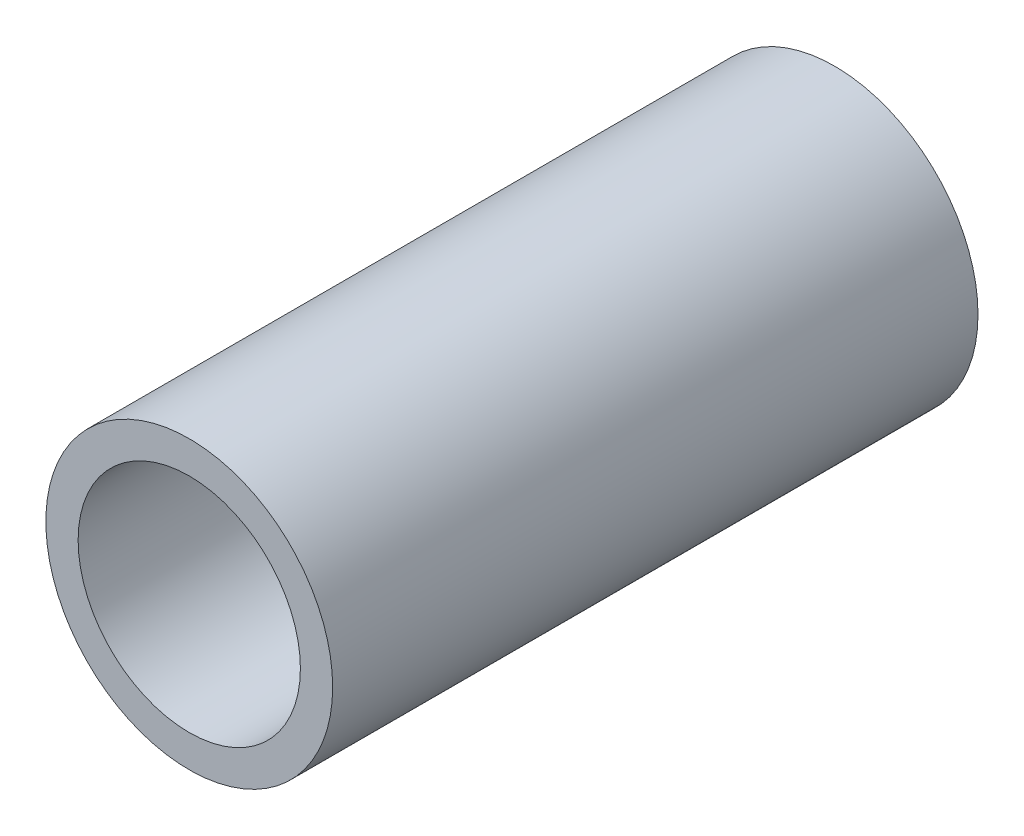
ISO-10303-21;
HEADER;
FILE_DESCRIPTION(('STEP AP214'),'2;1');
FILE_NAME('part.step','',(''),(''),'','','');
FILE_SCHEMA(('AUTOMOTIVE_DESIGN { 1 0 10303 214 1 1 1 1 }'));
ENDSEC;
DATA;
#1=APPLICATION_CONTEXT('core data for automotive mechanical design processes');
#2=APPLICATION_PROTOCOL_DEFINITION('international standard','automotive_design',2000,#1);
#3=PRODUCT_CONTEXT('',#1,'mechanical');
#4=PRODUCT('Part','Part','',(#3));
#5=PRODUCT_RELATED_PRODUCT_CATEGORY('part','',(#4));
#6=PRODUCT_DEFINITION_FORMATION('','',#4);
#7=PRODUCT_DEFINITION_CONTEXT('part definition',#1,'design');
#8=PRODUCT_DEFINITION('design','',#6,#7);
#9=PRODUCT_DEFINITION_SHAPE('','',#8);
#10=(LENGTH_UNIT() NAMED_UNIT(*) SI_UNIT(.MILLI.,.METRE.));
#11=(NAMED_UNIT(*) PLANE_ANGLE_UNIT() SI_UNIT($,.RADIAN.));
#12=(NAMED_UNIT(*) SI_UNIT($,.STERADIAN.) SOLID_ANGLE_UNIT());
#13=UNCERTAINTY_MEASURE_WITH_UNIT(LENGTH_MEASURE(1.E-05),#10,'distance_accuracy_value','');
#14=(GEOMETRIC_REPRESENTATION_CONTEXT(3) GLOBAL_UNCERTAINTY_ASSIGNED_CONTEXT((#13)) GLOBAL_UNIT_ASSIGNED_CONTEXT((#10,
#11,#12)) REPRESENTATION_CONTEXT('',''));
#15=CARTESIAN_POINT('',(0.,0.,0.));
#16=DIRECTION('',(0.,0.,1.));
#17=DIRECTION('',(1.,0.,0.));
#18=AXIS2_PLACEMENT_3D('',#15,#16,#17);
#19=CARTESIAN_POINT('',(0.,0.,4.5));
#20=DIRECTION('',(0.,0.,1.));
#21=DIRECTION('',(1.,0.,0.));
#22=AXIS2_PLACEMENT_3D('',#19,#20,#21);
#23=PLANE('',#22);
#24=CARTESIAN_POINT('',(0.,0.,4.5));
#25=DIRECTION('',(0.,0.,1.));
#26=DIRECTION('',(1.,0.,0.));
#27=AXIS2_PLACEMENT_3D('',#24,#25,#26);
#28=CIRCLE('',#27,1.);
#29=CARTESIAN_POINT('',(1.,0.,4.5));
#30=VERTEX_POINT('',#29);
#31=EDGE_CURVE('E10',#30,#30,#28,.T.);
#32=ORIENTED_EDGE('',*,*,#31,.T.);
#33=EDGE_LOOP('',(#32));
#34=FACE_BOUND('',#33,.T.);
#35=CARTESIAN_POINT('',(0.,0.,4.5));
#36=DIRECTION('',(0.,0.,1.));
#37=DIRECTION('',(1.,0.,0.));
#38=AXIS2_PLACEMENT_3D('',#35,#36,#37);
#39=CIRCLE('',#38,0.775);
#40=CARTESIAN_POINT('',(0.775,0.,4.5));
#41=VERTEX_POINT('',#40);
#42=EDGE_CURVE('E46',#41,#41,#39,.T.);
#43=ORIENTED_EDGE('',*,*,#42,.F.);
#44=EDGE_LOOP('',(#43));
#45=FACE_BOUND('',#44,.T.);
#46=ADVANCED_FACE('F35',(#34,#45),#23,.T.);
#47=CARTESIAN_POINT('',(0.,0.,0.));
#48=DIRECTION('',(0.,0.,1.));
#49=DIRECTION('',(1.,0.,0.));
#50=AXIS2_PLACEMENT_3D('',#47,#48,#49);
#51=PLANE('',#50);
#52=CARTESIAN_POINT('',(0.,0.,0.));
#53=DIRECTION('',(0.,0.,1.));
#54=DIRECTION('',(1.,0.,0.));
#55=AXIS2_PLACEMENT_3D('',#52,#53,#54);
#56=CIRCLE('',#55,1.);
#57=CARTESIAN_POINT('',(1.,0.,0.));
#58=VERTEX_POINT('',#57);
#59=EDGE_CURVE('E39',#58,#58,#56,.T.);
#60=ORIENTED_EDGE('',*,*,#59,.F.);
#61=EDGE_LOOP('',(#60));
#62=FACE_BOUND('',#61,.T.);
#63=CARTESIAN_POINT('',(0.,0.,0.));
#64=DIRECTION('',(0.,0.,1.));
#65=DIRECTION('',(1.,0.,0.));
#66=AXIS2_PLACEMENT_3D('',#63,#64,#65);
#67=CIRCLE('',#66,0.775);
#68=CARTESIAN_POINT('',(0.775,0.,0.));
#69=VERTEX_POINT('',#68);
#70=EDGE_CURVE('E48',#69,#69,#67,.T.);
#71=ORIENTED_EDGE('',*,*,#70,.T.);
#72=EDGE_LOOP('',(#71));
#73=FACE_BOUND('',#72,.T.);
#74=ADVANCED_FACE('F58',(#62,#73),#51,.F.);
#75=CARTESIAN_POINT('',(0.,0.,4.5));
#76=DIRECTION('',(0.,0.,-1.));
#77=DIRECTION('',(-1.,0.,0.));
#78=AXIS2_PLACEMENT_3D('',#75,#76,#77);
#79=CYLINDRICAL_SURFACE('',#78,1.);
#80=ORIENTED_EDGE('',*,*,#31,.F.);
#81=EDGE_LOOP('',(#80));
#82=FACE_BOUND('',#81,.T.);
#83=ORIENTED_EDGE('',*,*,#59,.T.);
#84=EDGE_LOOP('',(#83));
#85=FACE_BOUND('',#84,.T.);
#86=ADVANCED_FACE('F37',(#82,#85),#79,.T.);
#87=CARTESIAN_POINT('',(0.,0.,4.5));
#88=DIRECTION('',(0.,0.,-1.));
#89=DIRECTION('',(-1.,0.,0.));
#90=AXIS2_PLACEMENT_3D('',#87,#88,#89);
#91=CYLINDRICAL_SURFACE('',#90,0.775);
#92=ORIENTED_EDGE('',*,*,#42,.T.);
#93=EDGE_LOOP('',(#92));
#94=FACE_BOUND('',#93,.T.);
#95=ORIENTED_EDGE('',*,*,#70,.F.);
#96=EDGE_LOOP('',(#95));
#97=FACE_BOUND('',#96,.T.);
#98=ADVANCED_FACE('F54',(#94,#97),#91,.F.);
#99=CLOSED_SHELL('',(#46,#74,#86,#98));
#100=MANIFOLD_SOLID_BREP('B2',#99);
#101=ADVANCED_BREP_SHAPE_REPRESENTATION('',(#18,#100),#14);
#102=SHAPE_DEFINITION_REPRESENTATION(#9,#101);
ENDSEC;
END-ISO-10303-21;
